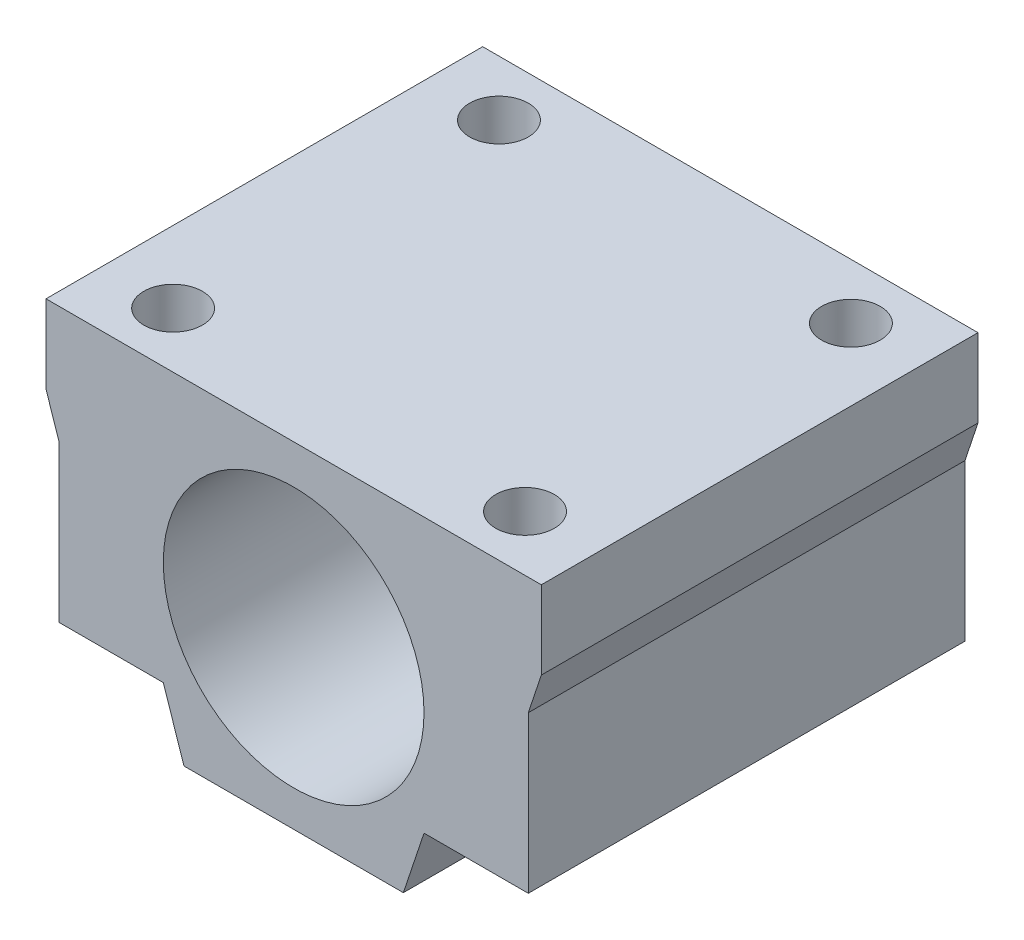
ISO-10303-21;
HEADER;
FILE_DESCRIPTION(('STEP AP214'),'2;1');
FILE_NAME('part.step','',(''),(''),'','','');
FILE_SCHEMA(('AUTOMOTIVE_DESIGN { 1 0 10303 214 1 1 1 1 }'));
ENDSEC;
DATA;
#1=APPLICATION_CONTEXT('core data for automotive mechanical design processes');
#2=APPLICATION_PROTOCOL_DEFINITION('international standard','automotive_design',2000,#1);
#3=PRODUCT_CONTEXT('',#1,'mechanical');
#4=PRODUCT('Part','Part','',(#3));
#5=PRODUCT_RELATED_PRODUCT_CATEGORY('part','',(#4));
#6=PRODUCT_DEFINITION_FORMATION('','',#4);
#7=PRODUCT_DEFINITION_CONTEXT('part definition',#1,'design');
#8=PRODUCT_DEFINITION('design','',#6,#7);
#9=PRODUCT_DEFINITION_SHAPE('','',#8);
#10=(LENGTH_UNIT() NAMED_UNIT(*) SI_UNIT(.MILLI.,.METRE.));
#11=(NAMED_UNIT(*) PLANE_ANGLE_UNIT() SI_UNIT($,.RADIAN.));
#12=(NAMED_UNIT(*) SI_UNIT($,.STERADIAN.) SOLID_ANGLE_UNIT());
#13=UNCERTAINTY_MEASURE_WITH_UNIT(LENGTH_MEASURE(1.E-05),#10,'distance_accuracy_value','');
#14=(GEOMETRIC_REPRESENTATION_CONTEXT(3) GLOBAL_UNCERTAINTY_ASSIGNED_CONTEXT((#13)) GLOBAL_UNIT_ASSIGNED_CONTEXT((#10,
#11,#12)) REPRESENTATION_CONTEXT('',''));
#15=CARTESIAN_POINT('',(0.,0.,0.));
#16=DIRECTION('',(0.,0.,1.));
#17=DIRECTION('',(1.,0.,0.));
#18=AXIS2_PLACEMENT_3D('',#15,#16,#17);
#19=CARTESIAN_POINT('',(-16.8333333333333,-25.5,-33.5));
#20=DIRECTION('',(-0.948683298050514,-0.316227766016838,0.));
#21=DIRECTION('',(0.316227766016838,-0.948683298050514,0.));
#22=AXIS2_PLACEMENT_3D('',#19,#20,#21);
#23=PLANE('',#22);
#24=DIRECTION('',(0.,0.,1.));
#25=VECTOR('',#24,1.);
#26=CARTESIAN_POINT('',(-16.8333333333333,-25.5,-33.5));
#27=LINE('',#26,#25);
#28=CARTESIAN_POINT('',(-16.8333333333333,-25.5,-33.5));
#29=VERTEX_POINT('',#28);
#30=CARTESIAN_POINT('',(-16.8333333333333,-25.5,33.5));
#31=VERTEX_POINT('',#30);
#32=EDGE_CURVE('E44',#29,#31,#27,.T.);
#33=ORIENTED_EDGE('',*,*,#32,.T.);
#34=DIRECTION('',(0.316227766016838,-0.948683298050514,0.));
#35=VECTOR('',#34,1.);
#36=CARTESIAN_POINT('',(-16.8333333333333,-25.5,33.5));
#37=LINE('',#36,#35);
#38=CARTESIAN_POINT('',(-20.,-16.,33.5));
#39=VERTEX_POINT('',#38);
#40=EDGE_CURVE('E130',#39,#31,#37,.T.);
#41=ORIENTED_EDGE('',*,*,#40,.F.);
#42=DIRECTION('',(0.,0.,1.));
#43=VECTOR('',#42,1.);
#44=CARTESIAN_POINT('',(-20.,-16.,-33.5));
#45=LINE('',#44,#43);
#46=CARTESIAN_POINT('',(-20.,-16.,-33.5));
#47=VERTEX_POINT('',#46);
#48=EDGE_CURVE('E11',#47,#39,#45,.T.);
#49=ORIENTED_EDGE('',*,*,#48,.F.);
#50=DIRECTION('',(0.316227766016838,-0.948683298050514,0.));
#51=VECTOR('',#50,1.);
#52=CARTESIAN_POINT('',(-16.8333333333333,-25.5,-33.5));
#53=LINE('',#52,#51);
#54=EDGE_CURVE('E131',#47,#29,#53,.T.);
#55=ORIENTED_EDGE('',*,*,#54,.T.);
#56=EDGE_LOOP('',(#33,#41,#49,#55));
#57=FACE_BOUND('',#56,.T.);
#58=ADVANCED_FACE('F41',(#57),#23,.T.);
#59=CARTESIAN_POINT('',(-20.,-16.,-33.5));
#60=DIRECTION('',(0.,-1.,0.));
#61=DIRECTION('',(1.,0.,0.));
#62=AXIS2_PLACEMENT_3D('',#59,#60,#61);
#63=PLANE('',#62);
#64=CARTESIAN_POINT('',(-27.,-16.,-25.));
#65=DIRECTION('',(0.,-1.,0.));
#66=DIRECTION('',(0.,0.,-1.));
#67=AXIS2_PLACEMENT_3D('',#64,#65,#66);
#68=CIRCLE('',#67,4.49999999999999);
#69=CARTESIAN_POINT('',(-27.,-16.,-29.5));
#70=VERTEX_POINT('',#69);
#71=EDGE_CURVE('E377',#70,#70,#68,.T.);
#72=ORIENTED_EDGE('',*,*,#71,.F.);
#73=EDGE_LOOP('',(#72));
#74=FACE_BOUND('',#73,.T.);
#75=CARTESIAN_POINT('',(-27.,-16.,25.));
#76=DIRECTION('',(0.,-1.,0.));
#77=DIRECTION('',(0.,0.,-1.));
#78=AXIS2_PLACEMENT_3D('',#75,#76,#77);
#79=CIRCLE('',#78,4.49999999999999);
#80=CARTESIAN_POINT('',(-27.,-16.,20.5));
#81=VERTEX_POINT('',#80);
#82=EDGE_CURVE('E391',#81,#81,#79,.T.);
#83=ORIENTED_EDGE('',*,*,#82,.F.);
#84=EDGE_LOOP('',(#83));
#85=FACE_BOUND('',#84,.T.);
#86=ORIENTED_EDGE('',*,*,#48,.T.);
#87=DIRECTION('',(1.,0.,0.));
#88=VECTOR('',#87,1.);
#89=CARTESIAN_POINT('',(-20.,-16.,33.5));
#90=LINE('',#89,#88);
#91=CARTESIAN_POINT('',(-36.,-16.,33.5));
#92=VERTEX_POINT('',#91);
#93=EDGE_CURVE('E151',#92,#39,#90,.T.);
#94=ORIENTED_EDGE('',*,*,#93,.F.);
#95=DIRECTION('',(0.,0.,1.));
#96=VECTOR('',#95,1.);
#97=CARTESIAN_POINT('',(-36.,-16.,-33.5));
#98=LINE('',#97,#96);
#99=CARTESIAN_POINT('',(-36.,-16.,-33.5));
#100=VERTEX_POINT('',#99);
#101=EDGE_CURVE('E50',#100,#92,#98,.T.);
#102=ORIENTED_EDGE('',*,*,#101,.F.);
#103=DIRECTION('',(1.,0.,0.));
#104=VECTOR('',#103,1.);
#105=CARTESIAN_POINT('',(-20.,-16.,-33.5));
#106=LINE('',#105,#104);
#107=EDGE_CURVE('E137',#100,#47,#106,.T.);
#108=ORIENTED_EDGE('',*,*,#107,.T.);
#109=EDGE_LOOP('',(#86,#94,#102,#108));
#110=FACE_BOUND('',#109,.T.);
#111=ADVANCED_FACE('F306',(#74,#85,#110),#63,.T.);
#112=CARTESIAN_POINT('',(-36.,-16.,-33.5));
#113=DIRECTION('',(-1.,0.,0.));
#114=DIRECTION('',(0.,0.,1.));
#115=AXIS2_PLACEMENT_3D('',#112,#113,#114);
#116=PLANE('',#115);
#117=ORIENTED_EDGE('',*,*,#101,.T.);
#118=DIRECTION('',(0.,-1.,0.));
#119=VECTOR('',#118,1.);
#120=CARTESIAN_POINT('',(-36.,-16.,33.5));
#121=LINE('',#120,#119);
#122=CARTESIAN_POINT('',(-36.,8.,33.5));
#123=VERTEX_POINT('',#122);
#124=EDGE_CURVE('E191',#123,#92,#121,.T.);
#125=ORIENTED_EDGE('',*,*,#124,.F.);
#126=DIRECTION('',(0.,0.,1.));
#127=VECTOR('',#126,1.);
#128=CARTESIAN_POINT('',(-36.,8.,-33.5));
#129=LINE('',#128,#127);
#130=CARTESIAN_POINT('',(-36.,8.,-33.5));
#131=VERTEX_POINT('',#130);
#132=EDGE_CURVE('E244',#131,#123,#129,.T.);
#133=ORIENTED_EDGE('',*,*,#132,.F.);
#134=DIRECTION('',(0.,-1.,0.));
#135=VECTOR('',#134,1.);
#136=CARTESIAN_POINT('',(-36.,-16.,-33.5));
#137=LINE('',#136,#135);
#138=EDGE_CURVE('E237',#131,#100,#137,.T.);
#139=ORIENTED_EDGE('',*,*,#138,.T.);
#140=EDGE_LOOP('',(#117,#125,#133,#139));
#141=FACE_BOUND('',#140,.T.);
#142=ADVANCED_FACE('F304',(#141),#116,.T.);
#143=CARTESIAN_POINT('',(-36.,8.,-33.5));
#144=DIRECTION('',(-0.948683298050514,-0.316227766016838,0.));
#145=DIRECTION('',(0.316227766016838,-0.948683298050514,0.));
#146=AXIS2_PLACEMENT_3D('',#143,#144,#145);
#147=PLANE('',#146);
#148=ORIENTED_EDGE('',*,*,#132,.T.);
#149=DIRECTION('',(0.316227766016838,-0.948683298050514,0.));
#150=VECTOR('',#149,1.);
#151=CARTESIAN_POINT('',(-36.,8.,33.5));
#152=LINE('',#151,#150);
#153=CARTESIAN_POINT('',(-38.,14.,33.5));
#154=VERTEX_POINT('',#153);
#155=EDGE_CURVE('E187',#154,#123,#152,.T.);
#156=ORIENTED_EDGE('',*,*,#155,.F.);
#157=DIRECTION('',(0.,0.,1.));
#158=VECTOR('',#157,1.);
#159=CARTESIAN_POINT('',(-38.,14.,-33.5));
#160=LINE('',#159,#158);
#161=CARTESIAN_POINT('',(-38.,14.,-33.5));
#162=VERTEX_POINT('',#161);
#163=EDGE_CURVE('E247',#162,#154,#160,.T.);
#164=ORIENTED_EDGE('',*,*,#163,.F.);
#165=DIRECTION('',(0.316227766016838,-0.948683298050514,0.));
#166=VECTOR('',#165,1.);
#167=CARTESIAN_POINT('',(-36.,8.,-33.5));
#168=LINE('',#167,#166);
#169=EDGE_CURVE('E233',#162,#131,#168,.T.);
#170=ORIENTED_EDGE('',*,*,#169,.T.);
#171=EDGE_LOOP('',(#148,#156,#164,#170));
#172=FACE_BOUND('',#171,.T.);
#173=ADVANCED_FACE('F302',(#172),#147,.T.);
#174=CARTESIAN_POINT('',(-38.,14.,-33.5));
#175=DIRECTION('',(-1.,0.,0.));
#176=DIRECTION('',(0.,0.,1.));
#177=AXIS2_PLACEMENT_3D('',#174,#175,#176);
#178=PLANE('',#177);
#179=ORIENTED_EDGE('',*,*,#163,.T.);
#180=DIRECTION('',(0.,-1.,0.));
#181=VECTOR('',#180,1.);
#182=CARTESIAN_POINT('',(-38.,14.,33.5));
#183=LINE('',#182,#181);
#184=CARTESIAN_POINT('',(-38.,26.,33.5));
#185=VERTEX_POINT('',#184);
#186=EDGE_CURVE('E183',#185,#154,#183,.T.);
#187=ORIENTED_EDGE('',*,*,#186,.F.);
#188=DIRECTION('',(0.,0.,1.));
#189=VECTOR('',#188,1.);
#190=CARTESIAN_POINT('',(-38.,26.,-33.5));
#191=LINE('',#190,#189);
#192=CARTESIAN_POINT('',(-38.,26.,-33.5));
#193=VERTEX_POINT('',#192);
#194=EDGE_CURVE('E250',#193,#185,#191,.T.);
#195=ORIENTED_EDGE('',*,*,#194,.F.);
#196=DIRECTION('',(0.,-1.,0.));
#197=VECTOR('',#196,1.);
#198=CARTESIAN_POINT('',(-38.,14.,-33.5));
#199=LINE('',#198,#197);
#200=EDGE_CURVE('E229',#193,#162,#199,.T.);
#201=ORIENTED_EDGE('',*,*,#200,.T.);
#202=EDGE_LOOP('',(#179,#187,#195,#201));
#203=FACE_BOUND('',#202,.T.);
#204=ADVANCED_FACE('F297',(#203),#178,.T.);
#205=CARTESIAN_POINT('',(-38.,26.,-33.5));
#206=DIRECTION('',(0.,1.,0.));
#207=DIRECTION('',(-1.,0.,0.));
#208=AXIS2_PLACEMENT_3D('',#205,#206,#207);
#209=PLANE('',#208);
#210=CARTESIAN_POINT('',(-27.,26.,-25.));
#211=DIRECTION('',(0.,-1.,0.));
#212=DIRECTION('',(0.,0.,-1.));
#213=AXIS2_PLACEMENT_3D('',#210,#211,#212);
#214=CIRCLE('',#213,4.49999999999999);
#215=CARTESIAN_POINT('',(-27.,26.,-29.5));
#216=VERTEX_POINT('',#215);
#217=EDGE_CURVE('E375',#216,#216,#214,.T.);
#218=ORIENTED_EDGE('',*,*,#217,.T.);
#219=EDGE_LOOP('',(#218));
#220=FACE_BOUND('',#219,.T.);
#221=CARTESIAN_POINT('',(27.,26.,-25.));
#222=DIRECTION('',(0.,-1.,0.));
#223=DIRECTION('',(0.,0.,-1.));
#224=AXIS2_PLACEMENT_3D('',#221,#222,#223);
#225=CIRCLE('',#224,4.49999999999999);
#226=CARTESIAN_POINT('',(27.,26.,-29.5));
#227=VERTEX_POINT('',#226);
#228=EDGE_CURVE('E387',#227,#227,#225,.T.);
#229=ORIENTED_EDGE('',*,*,#228,.T.);
#230=EDGE_LOOP('',(#229));
#231=FACE_BOUND('',#230,.T.);
#232=CARTESIAN_POINT('',(-27.,26.,25.));
#233=DIRECTION('',(0.,-1.,0.));
#234=DIRECTION('',(0.,0.,-1.));
#235=AXIS2_PLACEMENT_3D('',#232,#233,#234);
#236=CIRCLE('',#235,4.49999999999999);
#237=CARTESIAN_POINT('',(-27.,26.,20.5));
#238=VERTEX_POINT('',#237);
#239=EDGE_CURVE('E395',#238,#238,#236,.T.);
#240=ORIENTED_EDGE('',*,*,#239,.T.);
#241=EDGE_LOOP('',(#240));
#242=FACE_BOUND('',#241,.T.);
#243=CARTESIAN_POINT('',(27.,26.,25.));
#244=DIRECTION('',(0.,-1.,0.));
#245=DIRECTION('',(0.,0.,-1.));
#246=AXIS2_PLACEMENT_3D('',#243,#244,#245);
#247=CIRCLE('',#246,4.49999999999999);
#248=CARTESIAN_POINT('',(27.,26.,20.5));
#249=VERTEX_POINT('',#248);
#250=EDGE_CURVE('E157',#249,#249,#247,.T.);
#251=ORIENTED_EDGE('',*,*,#250,.T.);
#252=EDGE_LOOP('',(#251));
#253=FACE_BOUND('',#252,.T.);
#254=ORIENTED_EDGE('',*,*,#194,.T.);
#255=DIRECTION('',(-1.,0.,0.));
#256=VECTOR('',#255,1.);
#257=CARTESIAN_POINT('',(-38.,26.,33.5));
#258=LINE('',#257,#256);
#259=CARTESIAN_POINT('',(38.,26.,33.5));
#260=VERTEX_POINT('',#259);
#261=EDGE_CURVE('E179',#260,#185,#258,.T.);
#262=ORIENTED_EDGE('',*,*,#261,.F.);
#263=DIRECTION('',(0.,0.,1.));
#264=VECTOR('',#263,1.);
#265=CARTESIAN_POINT('',(38.,26.,-33.5));
#266=LINE('',#265,#264);
#267=CARTESIAN_POINT('',(38.,26.,-33.5));
#268=VERTEX_POINT('',#267);
#269=EDGE_CURVE('E253',#268,#260,#266,.T.);
#270=ORIENTED_EDGE('',*,*,#269,.F.);
#271=DIRECTION('',(-1.,0.,0.));
#272=VECTOR('',#271,1.);
#273=CARTESIAN_POINT('',(-38.,26.,-33.5));
#274=LINE('',#273,#272);
#275=EDGE_CURVE('E225',#268,#193,#274,.T.);
#276=ORIENTED_EDGE('',*,*,#275,.T.);
#277=EDGE_LOOP('',(#254,#262,#270,#276));
#278=FACE_BOUND('',#277,.T.);
#279=ADVANCED_FACE('F292',(#220,#231,#242,#253,#278),#209,.T.);
#280=CARTESIAN_POINT('',(38.,14.,-33.5));
#281=DIRECTION('',(1.,0.,0.));
#282=DIRECTION('',(0.,0.,-1.));
#283=AXIS2_PLACEMENT_3D('',#280,#281,#282);
#284=PLANE('',#283);
#285=ORIENTED_EDGE('',*,*,#269,.T.);
#286=DIRECTION('',(0.,1.,0.));
#287=VECTOR('',#286,1.);
#288=CARTESIAN_POINT('',(38.,14.,33.5));
#289=LINE('',#288,#287);
#290=CARTESIAN_POINT('',(38.,14.,33.5));
#291=VERTEX_POINT('',#290);
#292=EDGE_CURVE('E175',#291,#260,#289,.T.);
#293=ORIENTED_EDGE('',*,*,#292,.F.);
#294=DIRECTION('',(0.,0.,1.));
#295=VECTOR('',#294,1.);
#296=CARTESIAN_POINT('',(38.,14.,-33.5));
#297=LINE('',#296,#295);
#298=CARTESIAN_POINT('',(38.,14.,-33.5));
#299=VERTEX_POINT('',#298);
#300=EDGE_CURVE('E256',#299,#291,#297,.T.);
#301=ORIENTED_EDGE('',*,*,#300,.F.);
#302=DIRECTION('',(0.,1.,0.));
#303=VECTOR('',#302,1.);
#304=CARTESIAN_POINT('',(38.,14.,-33.5));
#305=LINE('',#304,#303);
#306=EDGE_CURVE('E221',#299,#268,#305,.T.);
#307=ORIENTED_EDGE('',*,*,#306,.T.);
#308=EDGE_LOOP('',(#285,#293,#301,#307));
#309=FACE_BOUND('',#308,.T.);
#310=ADVANCED_FACE('F290',(#309),#284,.T.);
#311=CARTESIAN_POINT('',(36.,8.00000000000001,-33.5));
#312=DIRECTION('',(0.948683298050514,-0.316227766016838,0.));
#313=DIRECTION('',(0.316227766016838,0.948683298050514,0.));
#314=AXIS2_PLACEMENT_3D('',#311,#312,#313);
#315=PLANE('',#314);
#316=ORIENTED_EDGE('',*,*,#300,.T.);
#317=DIRECTION('',(0.316227766016838,0.948683298050514,0.));
#318=VECTOR('',#317,1.);
#319=CARTESIAN_POINT('',(36.,8.00000000000001,33.5));
#320=LINE('',#319,#318);
#321=CARTESIAN_POINT('',(36.,8.00000000000001,33.5));
#322=VERTEX_POINT('',#321);
#323=EDGE_CURVE('E171',#322,#291,#320,.T.);
#324=ORIENTED_EDGE('',*,*,#323,.F.);
#325=DIRECTION('',(0.,0.,1.));
#326=VECTOR('',#325,1.);
#327=CARTESIAN_POINT('',(36.,8.00000000000001,-33.5));
#328=LINE('',#327,#326);
#329=CARTESIAN_POINT('',(36.,8.00000000000001,-33.5));
#330=VERTEX_POINT('',#329);
#331=EDGE_CURVE('E259',#330,#322,#328,.T.);
#332=ORIENTED_EDGE('',*,*,#331,.F.);
#333=DIRECTION('',(0.316227766016838,0.948683298050514,0.));
#334=VECTOR('',#333,1.);
#335=CARTESIAN_POINT('',(36.,8.00000000000001,-33.5));
#336=LINE('',#335,#334);
#337=EDGE_CURVE('E217',#330,#299,#336,.T.);
#338=ORIENTED_EDGE('',*,*,#337,.T.);
#339=EDGE_LOOP('',(#316,#324,#332,#338));
#340=FACE_BOUND('',#339,.T.);
#341=ADVANCED_FACE('F285',(#340),#315,.T.);
#342=CARTESIAN_POINT('',(36.,-16.,-33.5));
#343=DIRECTION('',(1.,0.,0.));
#344=DIRECTION('',(0.,1.,0.));
#345=AXIS2_PLACEMENT_3D('',#342,#343,#344);
#346=PLANE('',#345);
#347=ORIENTED_EDGE('',*,*,#331,.T.);
#348=DIRECTION('',(0.,1.,0.));
#349=VECTOR('',#348,1.);
#350=CARTESIAN_POINT('',(36.,-16.,33.5));
#351=LINE('',#350,#349);
#352=CARTESIAN_POINT('',(36.,-16.,33.5));
#353=VERTEX_POINT('',#352);
#354=EDGE_CURVE('E167',#353,#322,#351,.T.);
#355=ORIENTED_EDGE('',*,*,#354,.F.);
#356=DIRECTION('',(0.,0.,1.));
#357=VECTOR('',#356,1.);
#358=CARTESIAN_POINT('',(36.,-16.,-33.5));
#359=LINE('',#358,#357);
#360=CARTESIAN_POINT('',(36.,-16.,-33.5));
#361=VERTEX_POINT('',#360);
#362=EDGE_CURVE('E262',#361,#353,#359,.T.);
#363=ORIENTED_EDGE('',*,*,#362,.F.);
#364=DIRECTION('',(0.,1.,0.));
#365=VECTOR('',#364,1.);
#366=CARTESIAN_POINT('',(36.,-16.,-33.5));
#367=LINE('',#366,#365);
#368=EDGE_CURVE('E213',#361,#330,#367,.T.);
#369=ORIENTED_EDGE('',*,*,#368,.T.);
#370=EDGE_LOOP('',(#347,#355,#363,#369));
#371=FACE_BOUND('',#370,.T.);
#372=ADVANCED_FACE('F278',(#371),#346,.T.);
#373=CARTESIAN_POINT('',(20.,-16.,-33.5));
#374=DIRECTION('',(0.,-1.,0.));
#375=DIRECTION('',(1.,0.,0.));
#376=AXIS2_PLACEMENT_3D('',#373,#374,#375);
#377=PLANE('',#376);
#378=CARTESIAN_POINT('',(27.,-16.,-25.));
#379=DIRECTION('',(0.,-1.,0.));
#380=DIRECTION('',(0.,0.,-1.));
#381=AXIS2_PLACEMENT_3D('',#378,#379,#380);
#382=CIRCLE('',#381,4.49999999999999);
#383=CARTESIAN_POINT('',(27.,-16.,-29.5));
#384=VERTEX_POINT('',#383);
#385=EDGE_CURVE('E381',#384,#384,#382,.T.);
#386=ORIENTED_EDGE('',*,*,#385,.F.);
#387=EDGE_LOOP('',(#386));
#388=FACE_BOUND('',#387,.T.);
#389=CARTESIAN_POINT('',(27.,-16.,25.));
#390=DIRECTION('',(0.,-1.,0.));
#391=DIRECTION('',(0.,0.,-1.));
#392=AXIS2_PLACEMENT_3D('',#389,#390,#391);
#393=CIRCLE('',#392,4.49999999999999);
#394=CARTESIAN_POINT('',(27.,-16.,20.5));
#395=VERTEX_POINT('',#394);
#396=EDGE_CURVE('E399',#395,#395,#393,.T.);
#397=ORIENTED_EDGE('',*,*,#396,.F.);
#398=EDGE_LOOP('',(#397));
#399=FACE_BOUND('',#398,.T.);
#400=ORIENTED_EDGE('',*,*,#362,.T.);
#401=DIRECTION('',(1.,0.,0.));
#402=VECTOR('',#401,1.);
#403=CARTESIAN_POINT('',(20.,-16.,33.5));
#404=LINE('',#403,#402);
#405=CARTESIAN_POINT('',(20.,-16.,33.5));
#406=VERTEX_POINT('',#405);
#407=EDGE_CURVE('E163',#406,#353,#404,.T.);
#408=ORIENTED_EDGE('',*,*,#407,.F.);
#409=DIRECTION('',(0.,0.,1.));
#410=VECTOR('',#409,1.);
#411=CARTESIAN_POINT('',(20.,-16.,-33.5));
#412=LINE('',#411,#410);
#413=CARTESIAN_POINT('',(20.,-16.,-33.5));
#414=VERTEX_POINT('',#413);
#415=EDGE_CURVE('E265',#414,#406,#412,.T.);
#416=ORIENTED_EDGE('',*,*,#415,.F.);
#417=DIRECTION('',(1.,0.,0.));
#418=VECTOR('',#417,1.);
#419=CARTESIAN_POINT('',(20.,-16.,-33.5));
#420=LINE('',#419,#418);
#421=EDGE_CURVE('E209',#414,#361,#420,.T.);
#422=ORIENTED_EDGE('',*,*,#421,.T.);
#423=EDGE_LOOP('',(#400,#408,#416,#422));
#424=FACE_BOUND('',#423,.T.);
#425=ADVANCED_FACE('F275',(#388,#399,#424),#377,.T.);
#426=CARTESIAN_POINT('',(16.8333333333333,-25.5,-33.5));
#427=DIRECTION('',(0.948683298050514,-0.316227766016838,0.));
#428=DIRECTION('',(0.316227766016838,0.948683298050514,0.));
#429=AXIS2_PLACEMENT_3D('',#426,#427,#428);
#430=PLANE('',#429);
#431=ORIENTED_EDGE('',*,*,#415,.T.);
#432=DIRECTION('',(0.316227766016838,0.948683298050514,0.));
#433=VECTOR('',#432,1.);
#434=CARTESIAN_POINT('',(16.8333333333333,-25.5,33.5));
#435=LINE('',#434,#433);
#436=CARTESIAN_POINT('',(16.8333333333333,-25.5,33.5));
#437=VERTEX_POINT('',#436);
#438=EDGE_CURVE('E145',#437,#406,#435,.T.);
#439=ORIENTED_EDGE('',*,*,#438,.F.);
#440=DIRECTION('',(0.,0.,1.));
#441=VECTOR('',#440,1.);
#442=CARTESIAN_POINT('',(16.8333333333333,-25.5,-33.5));
#443=LINE('',#442,#441);
#444=CARTESIAN_POINT('',(16.8333333333333,-25.5,-33.5));
#445=VERTEX_POINT('',#444);
#446=EDGE_CURVE('E136',#445,#437,#443,.T.);
#447=ORIENTED_EDGE('',*,*,#446,.F.);
#448=DIRECTION('',(0.316227766016838,0.948683298050514,0.));
#449=VECTOR('',#448,1.);
#450=CARTESIAN_POINT('',(16.8333333333333,-25.5,-33.5));
#451=LINE('',#450,#449);
#452=EDGE_CURVE('E205',#445,#414,#451,.T.);
#453=ORIENTED_EDGE('',*,*,#452,.T.);
#454=EDGE_LOOP('',(#431,#439,#447,#453));
#455=FACE_BOUND('',#454,.T.);
#456=ADVANCED_FACE('F269',(#455),#430,.T.);
#457=CARTESIAN_POINT('',(16.8333333333333,-25.5,-33.5));
#458=DIRECTION('',(0.,-1.,0.));
#459=DIRECTION('',(1.,0.,0.));
#460=AXIS2_PLACEMENT_3D('',#457,#458,#459);
#461=PLANE('',#460);
#462=ORIENTED_EDGE('',*,*,#446,.T.);
#463=DIRECTION('',(1.,0.,0.));
#464=VECTOR('',#463,1.);
#465=CARTESIAN_POINT('',(16.8333333333333,-25.5,33.5));
#466=LINE('',#465,#464);
#467=EDGE_CURVE('E139',#31,#437,#466,.T.);
#468=ORIENTED_EDGE('',*,*,#467,.F.);
#469=ORIENTED_EDGE('',*,*,#32,.F.);
#470=DIRECTION('',(1.,0.,0.));
#471=VECTOR('',#470,1.);
#472=CARTESIAN_POINT('',(16.8333333333333,-25.5,-33.5));
#473=LINE('',#472,#471);
#474=EDGE_CURVE('E202',#29,#445,#473,.T.);
#475=ORIENTED_EDGE('',*,*,#474,.T.);
#476=EDGE_LOOP('',(#462,#468,#469,#475));
#477=FACE_BOUND('',#476,.T.);
#478=ADVANCED_FACE('F140',(#477),#461,.T.);
#479=CARTESIAN_POINT('',(0.,0.,-33.5));
#480=DIRECTION('',(0.,0.,1.));
#481=DIRECTION('',(1.,0.,0.));
#482=AXIS2_PLACEMENT_3D('',#479,#480,#481);
#483=PLANE('',#482);
#484=CARTESIAN_POINT('',(0.,0.,-33.5));
#485=DIRECTION('',(0.,0.,1.));
#486=DIRECTION('',(1.,0.,0.));
#487=AXIS2_PLACEMENT_3D('',#484,#485,#486);
#488=CIRCLE('',#487,20.);
#489=CARTESIAN_POINT('',(20.,0.,-33.5));
#490=VERTEX_POINT('',#489);
#491=EDGE_CURVE('E196',#490,#490,#488,.T.);
#492=ORIENTED_EDGE('',*,*,#491,.T.);
#493=EDGE_LOOP('',(#492));
#494=FACE_BOUND('',#493,.T.);
#495=ORIENTED_EDGE('',*,*,#54,.F.);
#496=ORIENTED_EDGE('',*,*,#107,.F.);
#497=ORIENTED_EDGE('',*,*,#138,.F.);
#498=ORIENTED_EDGE('',*,*,#169,.F.);
#499=ORIENTED_EDGE('',*,*,#200,.F.);
#500=ORIENTED_EDGE('',*,*,#275,.F.);
#501=ORIENTED_EDGE('',*,*,#306,.F.);
#502=ORIENTED_EDGE('',*,*,#337,.F.);
#503=ORIENTED_EDGE('',*,*,#368,.F.);
#504=ORIENTED_EDGE('',*,*,#421,.F.);
#505=ORIENTED_EDGE('',*,*,#452,.F.);
#506=ORIENTED_EDGE('',*,*,#474,.F.);
#507=EDGE_LOOP('',(#495,#496,#497,#498,#499,#500,#501,#502,#503,#504,#505,#506));
#508=FACE_BOUND('',#507,.T.);
#509=ADVANCED_FACE('F281',(#494,#508),#483,.F.);
#510=CARTESIAN_POINT('',(0.,0.,-33.5));
#511=DIRECTION('',(0.,0.,1.));
#512=DIRECTION('',(1.,0.,0.));
#513=AXIS2_PLACEMENT_3D('',#510,#511,#512);
#514=CYLINDRICAL_SURFACE('',#513,20.);
#515=ORIENTED_EDGE('',*,*,#491,.F.);
#516=EDGE_LOOP('',(#515));
#517=FACE_BOUND('',#516,.T.);
#518=CARTESIAN_POINT('',(0.,0.,33.5));
#519=DIRECTION('',(0.,0.,1.));
#520=DIRECTION('',(1.,0.,0.));
#521=AXIS2_PLACEMENT_3D('',#518,#519,#520);
#522=CIRCLE('',#521,20.);
#523=CARTESIAN_POINT('',(20.,0.,33.5));
#524=VERTEX_POINT('',#523);
#525=EDGE_CURVE('E153',#524,#524,#522,.T.);
#526=ORIENTED_EDGE('',*,*,#525,.T.);
#527=EDGE_LOOP('',(#526));
#528=FACE_BOUND('',#527,.T.);
#529=ADVANCED_FACE('F341',(#517,#528),#514,.F.);
#530=CARTESIAN_POINT('',(0.,0.,33.5));
#531=DIRECTION('',(0.,0.,1.));
#532=DIRECTION('',(1.,0.,0.));
#533=AXIS2_PLACEMENT_3D('',#530,#531,#532);
#534=PLANE('',#533);
#535=ORIENTED_EDGE('',*,*,#40,.T.);
#536=ORIENTED_EDGE('',*,*,#467,.T.);
#537=ORIENTED_EDGE('',*,*,#438,.T.);
#538=ORIENTED_EDGE('',*,*,#407,.T.);
#539=ORIENTED_EDGE('',*,*,#354,.T.);
#540=ORIENTED_EDGE('',*,*,#323,.T.);
#541=ORIENTED_EDGE('',*,*,#292,.T.);
#542=ORIENTED_EDGE('',*,*,#261,.T.);
#543=ORIENTED_EDGE('',*,*,#186,.T.);
#544=ORIENTED_EDGE('',*,*,#155,.T.);
#545=ORIENTED_EDGE('',*,*,#124,.T.);
#546=ORIENTED_EDGE('',*,*,#93,.T.);
#547=EDGE_LOOP('',(#535,#536,#537,#538,#539,#540,#541,#542,#543,#544,#545,#546));
#548=FACE_BOUND('',#547,.T.);
#549=ORIENTED_EDGE('',*,*,#525,.F.);
#550=EDGE_LOOP('',(#549));
#551=FACE_BOUND('',#550,.T.);
#552=ADVANCED_FACE('F148',(#548,#551),#534,.T.);
#553=CARTESIAN_POINT('',(27.,-16.,25.));
#554=DIRECTION('',(0.,-1.,0.));
#555=DIRECTION('',(0.,0.,-1.));
#556=AXIS2_PLACEMENT_3D('',#553,#554,#555);
#557=CYLINDRICAL_SURFACE('',#556,4.49999999999999);
#558=ORIENTED_EDGE('',*,*,#250,.F.);
#559=EDGE_LOOP('',(#558));
#560=FACE_BOUND('',#559,.T.);
#561=ORIENTED_EDGE('',*,*,#396,.T.);
#562=EDGE_LOOP('',(#561));
#563=FACE_BOUND('',#562,.T.);
#564=ADVANCED_FACE('F351',(#560,#563),#557,.F.);
#565=CARTESIAN_POINT('',(-27.,-16.,25.));
#566=DIRECTION('',(0.,-1.,0.));
#567=DIRECTION('',(0.,0.,-1.));
#568=AXIS2_PLACEMENT_3D('',#565,#566,#567);
#569=CYLINDRICAL_SURFACE('',#568,4.49999999999999);
#570=ORIENTED_EDGE('',*,*,#239,.F.);
#571=EDGE_LOOP('',(#570));
#572=FACE_BOUND('',#571,.T.);
#573=ORIENTED_EDGE('',*,*,#82,.T.);
#574=EDGE_LOOP('',(#573));
#575=FACE_BOUND('',#574,.T.);
#576=ADVANCED_FACE('F356',(#572,#575),#569,.F.);
#577=CARTESIAN_POINT('',(27.,-16.,-25.));
#578=DIRECTION('',(0.,-1.,0.));
#579=DIRECTION('',(0.,0.,-1.));
#580=AXIS2_PLACEMENT_3D('',#577,#578,#579);
#581=CYLINDRICAL_SURFACE('',#580,4.49999999999999);
#582=ORIENTED_EDGE('',*,*,#228,.F.);
#583=EDGE_LOOP('',(#582));
#584=FACE_BOUND('',#583,.T.);
#585=ORIENTED_EDGE('',*,*,#385,.T.);
#586=EDGE_LOOP('',(#585));
#587=FACE_BOUND('',#586,.T.);
#588=ADVANCED_FACE('F362',(#584,#587),#581,.F.);
#589=CARTESIAN_POINT('',(-27.,-16.,-25.));
#590=DIRECTION('',(0.,-1.,0.));
#591=DIRECTION('',(0.,0.,-1.));
#592=AXIS2_PLACEMENT_3D('',#589,#590,#591);
#593=CYLINDRICAL_SURFACE('',#592,4.49999999999999);
#594=ORIENTED_EDGE('',*,*,#217,.F.);
#595=EDGE_LOOP('',(#594));
#596=FACE_BOUND('',#595,.T.);
#597=ORIENTED_EDGE('',*,*,#71,.T.);
#598=EDGE_LOOP('',(#597));
#599=FACE_BOUND('',#598,.T.);
#600=ADVANCED_FACE('F366',(#596,#599),#593,.F.);
#601=CLOSED_SHELL('',(#58,#111,#142,#173,#204,#279,#310,#341,#372,#425,#456,#478,#509,#529,#552,
#564,#576,#588,#600));
#602=MANIFOLD_SOLID_BREP('B2',#601);
#603=ADVANCED_BREP_SHAPE_REPRESENTATION('',(#18,#602),#14);
#604=SHAPE_DEFINITION_REPRESENTATION(#9,#603);
ENDSEC;
END-ISO-10303-21;
